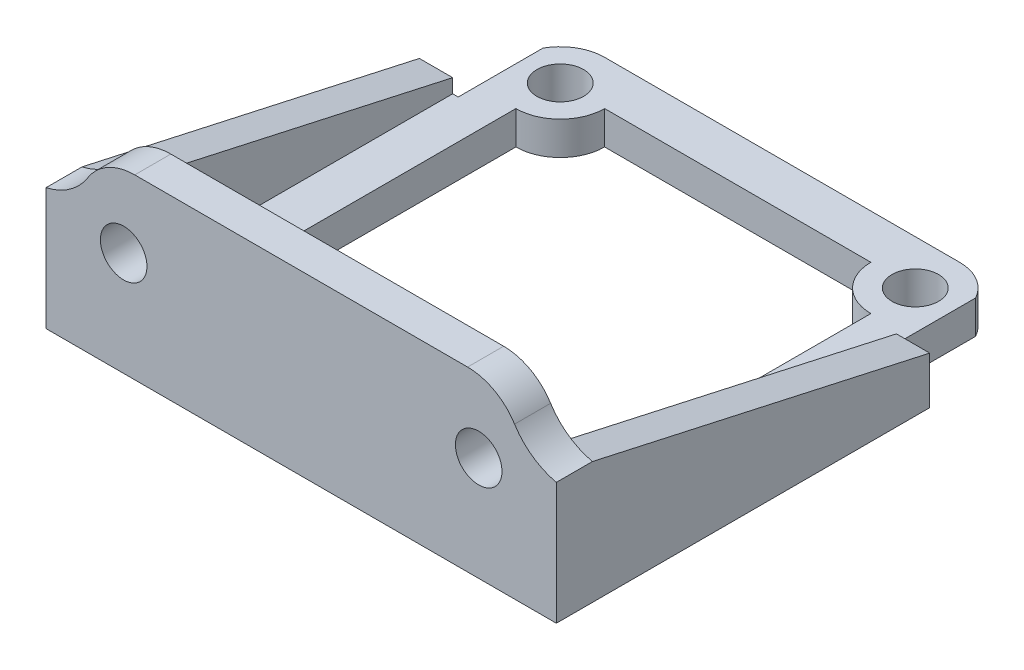
ISO-10303-21;
HEADER;
FILE_DESCRIPTION(('STEP AP214'),'2;1');
FILE_NAME('part.step','',(''),(''),'','','');
FILE_SCHEMA(('AUTOMOTIVE_DESIGN { 1 0 10303 214 1 1 1 1 }'));
ENDSEC;
DATA;
#1=APPLICATION_CONTEXT('core data for automotive mechanical design processes');
#2=APPLICATION_PROTOCOL_DEFINITION('international standard','automotive_design',2000,#1);
#3=PRODUCT_CONTEXT('',#1,'mechanical');
#4=PRODUCT('Part','Part','',(#3));
#5=PRODUCT_RELATED_PRODUCT_CATEGORY('part','',(#4));
#6=PRODUCT_DEFINITION_FORMATION('','',#4);
#7=PRODUCT_DEFINITION_CONTEXT('part definition',#1,'design');
#8=PRODUCT_DEFINITION('design','',#6,#7);
#9=PRODUCT_DEFINITION_SHAPE('','',#8);
#10=(LENGTH_UNIT() NAMED_UNIT(*) SI_UNIT(.MILLI.,.METRE.));
#11=(NAMED_UNIT(*) PLANE_ANGLE_UNIT() SI_UNIT($,.RADIAN.));
#12=(NAMED_UNIT(*) SI_UNIT($,.STERADIAN.) SOLID_ANGLE_UNIT());
#13=UNCERTAINTY_MEASURE_WITH_UNIT(LENGTH_MEASURE(1.E-05),#10,'distance_accuracy_value','');
#14=(GEOMETRIC_REPRESENTATION_CONTEXT(3) GLOBAL_UNCERTAINTY_ASSIGNED_CONTEXT((#13)) GLOBAL_UNIT_ASSIGNED_CONTEXT((#10,
#11,#12)) REPRESENTATION_CONTEXT('',''));
#15=CARTESIAN_POINT('',(0.,0.,0.));
#16=DIRECTION('',(0.,0.,1.));
#17=DIRECTION('',(1.,0.,0.));
#18=AXIS2_PLACEMENT_3D('',#15,#16,#17);
#19=CARTESIAN_POINT('',(32.,3.,-16.));
#20=DIRECTION('',(0.,1.,0.));
#21=DIRECTION('',(0.,0.,1.));
#22=AXIS2_PLACEMENT_3D('',#19,#20,#21);
#23=PLANE('',#22);
#24=DIRECTION('',(0.,0.,-1.));
#25=VECTOR('',#24,1.);
#26=CARTESIAN_POINT('',(-3.49999999999999,3.,-10.3021288200892));
#27=LINE('',#26,#25);
#28=CARTESIAN_POINT('',(-3.49999999999999,3.,-10.3021288200892));
#29=VERTEX_POINT('',#28);
#30=CARTESIAN_POINT('',(-3.49999999999999,3.,-17.9364916731037));
#31=VERTEX_POINT('',#30);
#32=EDGE_CURVE('E311',#29,#31,#27,.T.);
#33=ORIENTED_EDGE('',*,*,#32,.F.);
#34=DIRECTION('',(1.,0.,0.));
#35=VECTOR('',#34,1.);
#36=CARTESIAN_POINT('',(-6.99999999999999,3.,-10.3021288200892));
#37=LINE('',#36,#35);
#38=CARTESIAN_POINT('',(-4.,3.,-10.3021288200892));
#39=VERTEX_POINT('',#38);
#40=EDGE_CURVE('E538',#39,#29,#37,.T.);
#41=ORIENTED_EDGE('',*,*,#40,.F.);
#42=DIRECTION('',(0.,0.,-1.));
#43=VECTOR('',#42,1.);
#44=CARTESIAN_POINT('',(-4.,3.,-16.));
#45=LINE('',#44,#43);
#46=CARTESIAN_POINT('',(-4.,3.,20.1015847961172));
#47=VERTEX_POINT('',#46);
#48=EDGE_CURVE('E349',#47,#39,#45,.T.);
#49=ORIENTED_EDGE('',*,*,#48,.F.);
#50=DIRECTION('',(-1.,0.,0.));
#51=VECTOR('',#50,1.);
#52=CARTESIAN_POINT('',(-4.,3.,20.1015847961172));
#53=LINE('',#52,#51);
#54=CARTESIAN_POINT('',(36.,3.,20.1015847961172));
#55=VERTEX_POINT('',#54);
#56=EDGE_CURVE('E236',#55,#47,#53,.T.);
#57=ORIENTED_EDGE('',*,*,#56,.F.);
#58=DIRECTION('',(0.,0.,-1.));
#59=VECTOR('',#58,1.);
#60=CARTESIAN_POINT('',(36.,3.,23.3515847961172));
#61=LINE('',#60,#59);
#62=CARTESIAN_POINT('',(36.,3.,-10.3021288200892));
#63=VERTEX_POINT('',#62);
#64=EDGE_CURVE('E215',#55,#63,#61,.T.);
#65=ORIENTED_EDGE('',*,*,#64,.T.);
#66=DIRECTION('',(1.,0.,0.));
#67=VECTOR('',#66,1.);
#68=CARTESIAN_POINT('',(39.,3.,-10.3021288200892));
#69=LINE('',#68,#67);
#70=CARTESIAN_POINT('',(35.5,3.,-10.3021288200892));
#71=VERTEX_POINT('',#70);
#72=EDGE_CURVE('E223',#71,#63,#69,.T.);
#73=ORIENTED_EDGE('',*,*,#72,.F.);
#74=DIRECTION('',(0.,0.,1.));
#75=VECTOR('',#74,1.);
#76=CARTESIAN_POINT('',(35.5,3.,-10.3021288200892));
#77=LINE('',#76,#75);
#78=CARTESIAN_POINT('',(35.5,3.,-17.9364916731037));
#79=VERTEX_POINT('',#78);
#80=EDGE_CURVE('E230',#79,#71,#77,.T.);
#81=ORIENTED_EDGE('',*,*,#80,.F.);
#82=CARTESIAN_POINT('',(32.,3.,-16.));
#83=DIRECTION('',(0.,1.,0.));
#84=DIRECTION('',(0.,0.,1.));
#85=AXIS2_PLACEMENT_3D('',#82,#83,#84);
#86=CIRCLE('',#85,4.);
#87=CARTESIAN_POINT('',(32.,3.,-20.));
#88=VERTEX_POINT('',#87);
#89=EDGE_CURVE('E237',#79,#88,#86,.T.);
#90=ORIENTED_EDGE('',*,*,#89,.T.);
#91=DIRECTION('',(-1.,0.,0.));
#92=VECTOR('',#91,1.);
#93=CARTESIAN_POINT('',(0.,3.,-20.));
#94=LINE('',#93,#92);
#95=CARTESIAN_POINT('',(0.,3.,-20.));
#96=VERTEX_POINT('',#95);
#97=EDGE_CURVE('E240',#88,#96,#94,.T.);
#98=ORIENTED_EDGE('',*,*,#97,.T.);
#99=CARTESIAN_POINT('',(0.,3.,-16.));
#100=DIRECTION('',(0.,1.,0.));
#101=DIRECTION('',(0.,0.,1.));
#102=AXIS2_PLACEMENT_3D('',#99,#100,#101);
#103=CIRCLE('',#102,4.);
#104=EDGE_CURVE('E250',#96,#31,#103,.T.);
#105=ORIENTED_EDGE('',*,*,#104,.T.);
#106=EDGE_LOOP('',(#33,#41,#49,#57,#65,#73,#81,#90,#98,#105));
#107=FACE_BOUND('',#106,.T.);
#108=CARTESIAN_POINT('',(32.,3.,-16.));
#109=DIRECTION('',(0.,1.,0.));
#110=DIRECTION('',(0.,0.,1.));
#111=AXIS2_PLACEMENT_3D('',#108,#109,#110);
#112=CIRCLE('',#111,2.1);
#113=CARTESIAN_POINT('',(32.,3.,-13.9));
#114=VERTEX_POINT('',#113);
#115=EDGE_CURVE('E454',#114,#114,#112,.T.);
#116=ORIENTED_EDGE('',*,*,#115,.F.);
#117=EDGE_LOOP('',(#116));
#118=FACE_BOUND('',#117,.T.);
#119=CARTESIAN_POINT('',(0.,3.,-16.));
#120=DIRECTION('',(0.,1.,0.));
#121=DIRECTION('',(0.,0.,1.));
#122=AXIS2_PLACEMENT_3D('',#119,#120,#121);
#123=CIRCLE('',#122,2.1);
#124=CARTESIAN_POINT('',(0.,3.,-13.9));
#125=VERTEX_POINT('',#124);
#126=EDGE_CURVE('E257',#125,#125,#123,.T.);
#127=ORIENTED_EDGE('',*,*,#126,.F.);
#128=EDGE_LOOP('',(#127));
#129=FACE_BOUND('',#128,.T.);
#130=CARTESIAN_POINT('',(0.,3.,16.));
#131=DIRECTION('',(0.,1.,0.));
#132=DIRECTION('',(0.,0.,1.));
#133=AXIS2_PLACEMENT_3D('',#130,#131,#132);
#134=CIRCLE('',#133,2.1);
#135=CARTESIAN_POINT('',(0.,3.,18.1));
#136=VERTEX_POINT('',#135);
#137=EDGE_CURVE('E460',#136,#136,#134,.T.);
#138=ORIENTED_EDGE('',*,*,#137,.F.);
#139=EDGE_LOOP('',(#138));
#140=FACE_BOUND('',#139,.T.);
#141=CARTESIAN_POINT('',(32.,3.,16.));
#142=DIRECTION('',(0.,1.,0.));
#143=DIRECTION('',(0.,0.,1.));
#144=AXIS2_PLACEMENT_3D('',#141,#142,#143);
#145=CIRCLE('',#144,2.1);
#146=CARTESIAN_POINT('',(32.,3.,18.1));
#147=VERTEX_POINT('',#146);
#148=EDGE_CURVE('E448',#147,#147,#145,.T.);
#149=ORIENTED_EDGE('',*,*,#148,.F.);
#150=EDGE_LOOP('',(#149));
#151=FACE_BOUND('',#150,.T.);
#152=DIRECTION('',(0.,0.,1.));
#153=VECTOR('',#152,1.);
#154=CARTESIAN_POINT('',(0.,3.,-12.));
#155=LINE('',#154,#153);
#156=CARTESIAN_POINT('',(0.,3.,-12.));
#157=VERTEX_POINT('',#156);
#158=CARTESIAN_POINT('',(0.,3.,12.));
#159=VERTEX_POINT('',#158);
#160=EDGE_CURVE('E391',#157,#159,#155,.T.);
#161=ORIENTED_EDGE('',*,*,#160,.F.);
#162=CARTESIAN_POINT('',(0.,3.,-16.));
#163=DIRECTION('',(0.,-1.,0.));
#164=DIRECTION('',(0.,0.,1.));
#165=AXIS2_PLACEMENT_3D('',#162,#163,#164);
#166=CIRCLE('',#165,4.);
#167=CARTESIAN_POINT('',(3.99999999999999,3.,-16.));
#168=VERTEX_POINT('',#167);
#169=EDGE_CURVE('E389',#168,#157,#166,.T.);
#170=ORIENTED_EDGE('',*,*,#169,.F.);
#171=DIRECTION('',(-1.,0.,0.));
#172=VECTOR('',#171,1.);
#173=CARTESIAN_POINT('',(3.99999999999999,3.,-16.));
#174=LINE('',#173,#172);
#175=CARTESIAN_POINT('',(28.,3.,-16.));
#176=VERTEX_POINT('',#175);
#177=EDGE_CURVE('E405',#176,#168,#174,.T.);
#178=ORIENTED_EDGE('',*,*,#177,.F.);
#179=CARTESIAN_POINT('',(32.,3.,-16.));
#180=DIRECTION('',(0.,-1.,0.));
#181=DIRECTION('',(0.,0.,1.));
#182=AXIS2_PLACEMENT_3D('',#179,#180,#181);
#183=CIRCLE('',#182,4.);
#184=CARTESIAN_POINT('',(32.,3.,-12.));
#185=VERTEX_POINT('',#184);
#186=EDGE_CURVE('E402',#185,#176,#183,.T.);
#187=ORIENTED_EDGE('',*,*,#186,.F.);
#188=DIRECTION('',(0.,0.,-1.));
#189=VECTOR('',#188,1.);
#190=CARTESIAN_POINT('',(32.,3.,-12.));
#191=LINE('',#190,#189);
#192=CARTESIAN_POINT('',(32.,3.,12.));
#193=VERTEX_POINT('',#192);
#194=EDGE_CURVE('E400',#193,#185,#191,.T.);
#195=ORIENTED_EDGE('',*,*,#194,.F.);
#196=CARTESIAN_POINT('',(32.,3.,16.));
#197=DIRECTION('',(0.,-1.,0.));
#198=DIRECTION('',(0.,0.,1.));
#199=AXIS2_PLACEMENT_3D('',#196,#197,#198);
#200=CIRCLE('',#199,4.);
#201=CARTESIAN_POINT('',(28.,3.,16.));
#202=VERTEX_POINT('',#201);
#203=EDGE_CURVE('E398',#202,#193,#200,.T.);
#204=ORIENTED_EDGE('',*,*,#203,.F.);
#205=DIRECTION('',(1.,0.,0.));
#206=VECTOR('',#205,1.);
#207=CARTESIAN_POINT('',(4.,3.,16.));
#208=LINE('',#207,#206);
#209=CARTESIAN_POINT('',(4.,3.,16.));
#210=VERTEX_POINT('',#209);
#211=EDGE_CURVE('E396',#210,#202,#208,.T.);
#212=ORIENTED_EDGE('',*,*,#211,.F.);
#213=CARTESIAN_POINT('',(0.,3.,16.));
#214=DIRECTION('',(0.,-1.,0.));
#215=DIRECTION('',(0.,0.,1.));
#216=AXIS2_PLACEMENT_3D('',#213,#214,#215);
#217=CIRCLE('',#216,4.);
#218=EDGE_CURVE('E394',#159,#210,#217,.T.);
#219=ORIENTED_EDGE('',*,*,#218,.F.);
#220=EDGE_LOOP('',(#161,#170,#178,#187,#195,#204,#212,#219));
#221=FACE_BOUND('',#220,.T.);
#222=ADVANCED_FACE('F35',(#107,#118,#129,#140,#151,#221),#23,.T.);
#223=CARTESIAN_POINT('',(32.,0.,-16.));
#224=DIRECTION('',(0.,1.,0.));
#225=DIRECTION('',(0.,0.,1.));
#226=AXIS2_PLACEMENT_3D('',#223,#224,#225);
#227=PLANE('',#226);
#228=CARTESIAN_POINT('',(32.,0.,16.));
#229=DIRECTION('',(0.,1.,0.));
#230=DIRECTION('',(0.,0.,1.));
#231=AXIS2_PLACEMENT_3D('',#228,#229,#230);
#232=CIRCLE('',#231,2.1);
#233=CARTESIAN_POINT('',(32.,0.,18.1));
#234=VERTEX_POINT('',#233);
#235=EDGE_CURVE('E447',#234,#234,#232,.T.);
#236=ORIENTED_EDGE('',*,*,#235,.T.);
#237=EDGE_LOOP('',(#236));
#238=FACE_BOUND('',#237,.T.);
#239=CARTESIAN_POINT('',(32.,0.,-16.));
#240=DIRECTION('',(0.,1.,0.));
#241=DIRECTION('',(0.,0.,1.));
#242=AXIS2_PLACEMENT_3D('',#239,#240,#241);
#243=CIRCLE('',#242,2.1);
#244=CARTESIAN_POINT('',(32.,0.,-13.9));
#245=VERTEX_POINT('',#244);
#246=EDGE_CURVE('E451',#245,#245,#243,.T.);
#247=ORIENTED_EDGE('',*,*,#246,.T.);
#248=EDGE_LOOP('',(#247));
#249=FACE_BOUND('',#248,.T.);
#250=CARTESIAN_POINT('',(0.,0.,16.));
#251=DIRECTION('',(0.,1.,0.));
#252=DIRECTION('',(0.,0.,1.));
#253=AXIS2_PLACEMENT_3D('',#250,#251,#252);
#254=CIRCLE('',#253,2.1);
#255=CARTESIAN_POINT('',(0.,0.,18.1));
#256=VERTEX_POINT('',#255);
#257=EDGE_CURVE('E457',#256,#256,#254,.T.);
#258=ORIENTED_EDGE('',*,*,#257,.T.);
#259=EDGE_LOOP('',(#258));
#260=FACE_BOUND('',#259,.T.);
#261=CARTESIAN_POINT('',(0.,0.,-16.));
#262=DIRECTION('',(0.,1.,0.));
#263=DIRECTION('',(0.,0.,1.));
#264=AXIS2_PLACEMENT_3D('',#261,#262,#263);
#265=CIRCLE('',#264,2.1);
#266=CARTESIAN_POINT('',(0.,0.,-13.9));
#267=VERTEX_POINT('',#266);
#268=EDGE_CURVE('E246',#267,#267,#265,.T.);
#269=ORIENTED_EDGE('',*,*,#268,.T.);
#270=EDGE_LOOP('',(#269));
#271=FACE_BOUND('',#270,.T.);
#272=DIRECTION('',(1.,0.,0.));
#273=VECTOR('',#272,1.);
#274=CARTESIAN_POINT('',(32.,0.,-10.3021288200892));
#275=LINE('',#274,#273);
#276=CARTESIAN_POINT('',(-6.99999999999999,0.,-10.3021288200892));
#277=VERTEX_POINT('',#276);
#278=CARTESIAN_POINT('',(-3.49999999999999,0.,-10.3021288200892));
#279=VERTEX_POINT('',#278);
#280=EDGE_CURVE('E326',#277,#279,#275,.T.);
#281=ORIENTED_EDGE('',*,*,#280,.T.);
#282=DIRECTION('',(0.,0.,-1.));
#283=VECTOR('',#282,1.);
#284=CARTESIAN_POINT('',(-3.5,0.,-16.));
#285=LINE('',#284,#283);
#286=CARTESIAN_POINT('',(-3.49999999999999,0.,-17.9364916731037));
#287=VERTEX_POINT('',#286);
#288=EDGE_CURVE('E324',#279,#287,#285,.T.);
#289=ORIENTED_EDGE('',*,*,#288,.T.);
#290=CARTESIAN_POINT('',(0.,0.,-16.));
#291=DIRECTION('',(0.,1.,0.));
#292=DIRECTION('',(0.,0.,1.));
#293=AXIS2_PLACEMENT_3D('',#290,#291,#292);
#294=CIRCLE('',#293,4.);
#295=CARTESIAN_POINT('',(0.,0.,-20.));
#296=VERTEX_POINT('',#295);
#297=EDGE_CURVE('E238',#296,#287,#294,.T.);
#298=ORIENTED_EDGE('',*,*,#297,.F.);
#299=DIRECTION('',(-1.,0.,0.));
#300=VECTOR('',#299,1.);
#301=CARTESIAN_POINT('',(0.,0.,-20.));
#302=LINE('',#301,#300);
#303=CARTESIAN_POINT('',(32.,0.,-20.));
#304=VERTEX_POINT('',#303);
#305=EDGE_CURVE('E243',#304,#296,#302,.T.);
#306=ORIENTED_EDGE('',*,*,#305,.F.);
#307=CARTESIAN_POINT('',(32.,0.,-16.));
#308=DIRECTION('',(0.,1.,0.));
#309=DIRECTION('',(0.,0.,1.));
#310=AXIS2_PLACEMENT_3D('',#307,#308,#309);
#311=CIRCLE('',#310,4.);
#312=CARTESIAN_POINT('',(35.5,0.,-17.9364916731037));
#313=VERTEX_POINT('',#312);
#314=EDGE_CURVE('E256',#313,#304,#311,.T.);
#315=ORIENTED_EDGE('',*,*,#314,.F.);
#316=DIRECTION('',(0.,0.,1.));
#317=VECTOR('',#316,1.);
#318=CARTESIAN_POINT('',(35.5,0.,-16.));
#319=LINE('',#318,#317);
#320=CARTESIAN_POINT('',(35.5,0.,-10.3021288200892));
#321=VERTEX_POINT('',#320);
#322=EDGE_CURVE('E328',#313,#321,#319,.T.);
#323=ORIENTED_EDGE('',*,*,#322,.T.);
#324=DIRECTION('',(1.,0.,0.));
#325=VECTOR('',#324,1.);
#326=CARTESIAN_POINT('',(32.,0.,-10.3021288200892));
#327=LINE('',#326,#325);
#328=CARTESIAN_POINT('',(39.,0.,-10.3021288200892));
#329=VERTEX_POINT('',#328);
#330=EDGE_CURVE('E329',#321,#329,#327,.T.);
#331=ORIENTED_EDGE('',*,*,#330,.T.);
#332=DIRECTION('',(0.,0.,-1.));
#333=VECTOR('',#332,1.);
#334=CARTESIAN_POINT('',(39.,0.,-12.));
#335=LINE('',#334,#333);
#336=CARTESIAN_POINT('',(39.,0.,23.3515847961172));
#337=VERTEX_POINT('',#336);
#338=EDGE_CURVE('E359',#337,#329,#335,.T.);
#339=ORIENTED_EDGE('',*,*,#338,.F.);
#340=DIRECTION('',(1.,0.,0.));
#341=VECTOR('',#340,1.);
#342=CARTESIAN_POINT('',(-4.,0.,23.3515847961172));
#343=LINE('',#342,#341);
#344=CARTESIAN_POINT('',(-7.,0.,23.3515847961172));
#345=VERTEX_POINT('',#344);
#346=EDGE_CURVE('E254',#345,#337,#343,.T.);
#347=ORIENTED_EDGE('',*,*,#346,.F.);
#348=DIRECTION('',(0.,0.,1.));
#349=VECTOR('',#348,1.);
#350=CARTESIAN_POINT('',(-7.,0.,23.3515847961172));
#351=LINE('',#350,#349);
#352=EDGE_CURVE('E338',#277,#345,#351,.T.);
#353=ORIENTED_EDGE('',*,*,#352,.F.);
#354=EDGE_LOOP('',(#281,#289,#298,#306,#315,#323,#331,#339,#347,#353));
#355=FACE_BOUND('',#354,.T.);
#356=CARTESIAN_POINT('',(0.,0.,-16.));
#357=DIRECTION('',(0.,-1.,0.));
#358=DIRECTION('',(0.,0.,1.));
#359=AXIS2_PLACEMENT_3D('',#356,#357,#358);
#360=CIRCLE('',#359,4.);
#361=CARTESIAN_POINT('',(4.,0.,-16.));
#362=VERTEX_POINT('',#361);
#363=CARTESIAN_POINT('',(0.,0.,-12.));
#364=VERTEX_POINT('',#363);
#365=EDGE_CURVE('E388',#362,#364,#360,.T.);
#366=ORIENTED_EDGE('',*,*,#365,.T.);
#367=DIRECTION('',(0.,0.,1.));
#368=VECTOR('',#367,1.);
#369=CARTESIAN_POINT('',(0.,0.,-12.));
#370=LINE('',#369,#368);
#371=CARTESIAN_POINT('',(0.,0.,12.));
#372=VERTEX_POINT('',#371);
#373=EDGE_CURVE('E410',#364,#372,#370,.T.);
#374=ORIENTED_EDGE('',*,*,#373,.T.);
#375=CARTESIAN_POINT('',(0.,0.,16.));
#376=DIRECTION('',(0.,-1.,0.));
#377=DIRECTION('',(0.,0.,1.));
#378=AXIS2_PLACEMENT_3D('',#375,#376,#377);
#379=CIRCLE('',#378,4.);
#380=CARTESIAN_POINT('',(4.,0.,16.));
#381=VERTEX_POINT('',#380);
#382=EDGE_CURVE('E413',#372,#381,#379,.T.);
#383=ORIENTED_EDGE('',*,*,#382,.T.);
#384=DIRECTION('',(1.,0.,0.));
#385=VECTOR('',#384,1.);
#386=CARTESIAN_POINT('',(4.,0.,16.));
#387=LINE('',#386,#385);
#388=CARTESIAN_POINT('',(28.,0.,16.));
#389=VERTEX_POINT('',#388);
#390=EDGE_CURVE('E416',#381,#389,#387,.T.);
#391=ORIENTED_EDGE('',*,*,#390,.T.);
#392=CARTESIAN_POINT('',(32.,0.,16.));
#393=DIRECTION('',(0.,-1.,0.));
#394=DIRECTION('',(0.,0.,1.));
#395=AXIS2_PLACEMENT_3D('',#392,#393,#394);
#396=CIRCLE('',#395,4.);
#397=CARTESIAN_POINT('',(32.,0.,12.));
#398=VERTEX_POINT('',#397);
#399=EDGE_CURVE('E419',#389,#398,#396,.T.);
#400=ORIENTED_EDGE('',*,*,#399,.T.);
#401=DIRECTION('',(0.,0.,-1.));
#402=VECTOR('',#401,1.);
#403=CARTESIAN_POINT('',(32.,0.,-12.));
#404=LINE('',#403,#402);
#405=CARTESIAN_POINT('',(32.,0.,-12.));
#406=VERTEX_POINT('',#405);
#407=EDGE_CURVE('E422',#398,#406,#404,.T.);
#408=ORIENTED_EDGE('',*,*,#407,.T.);
#409=CARTESIAN_POINT('',(32.,0.,-16.));
#410=DIRECTION('',(0.,-1.,0.));
#411=DIRECTION('',(0.,0.,1.));
#412=AXIS2_PLACEMENT_3D('',#409,#410,#411);
#413=CIRCLE('',#412,4.);
#414=CARTESIAN_POINT('',(28.,0.,-16.));
#415=VERTEX_POINT('',#414);
#416=EDGE_CURVE('E425',#406,#415,#413,.T.);
#417=ORIENTED_EDGE('',*,*,#416,.T.);
#418=DIRECTION('',(-1.,0.,0.));
#419=VECTOR('',#418,1.);
#420=CARTESIAN_POINT('',(3.99999999999999,0.,-16.));
#421=LINE('',#420,#419);
#422=EDGE_CURVE('E392',#415,#362,#421,.T.);
#423=ORIENTED_EDGE('',*,*,#422,.T.);
#424=EDGE_LOOP('',(#366,#374,#383,#391,#400,#408,#417,#423));
#425=FACE_BOUND('',#424,.T.);
#426=ADVANCED_FACE('F321',(#238,#249,#260,#271,#355,#425),#227,.F.);
#427=CARTESIAN_POINT('',(-4.,3.,23.3515847961172));
#428=DIRECTION('',(0.,0.,-1.));
#429=DIRECTION('',(-1.,0.,0.));
#430=AXIS2_PLACEMENT_3D('',#427,#428,#429);
#431=PLANE('',#430);
#432=CARTESIAN_POINT('',(0.00061680222324112,9.39621606842088,23.3515847961172));
#433=DIRECTION('',(0.,0.,-1.));
#434=DIRECTION('',(-1.,0.,0.));
#435=AXIS2_PLACEMENT_3D('',#432,#433,#434);
#436=CIRCLE('',#435,2.1);
#437=CARTESIAN_POINT('',(-2.09938319777676,9.39621606842088,23.3515847961172));
#438=VERTEX_POINT('',#437);
#439=EDGE_CURVE('E373',#438,#438,#436,.T.);
#440=ORIENTED_EDGE('',*,*,#439,.T.);
#441=EDGE_LOOP('',(#440));
#442=FACE_BOUND('',#441,.T.);
#443=CARTESIAN_POINT('',(31.9993831977767,9.39621606842088,23.3515847961172));
#444=DIRECTION('',(0.,0.,-1.));
#445=DIRECTION('',(-1.,0.,0.));
#446=AXIS2_PLACEMENT_3D('',#443,#444,#445);
#447=CIRCLE('',#446,2.1);
#448=CARTESIAN_POINT('',(29.8993831977767,9.39621606842088,23.3515847961172));
#449=VERTEX_POINT('',#448);
#450=EDGE_CURVE('E368',#449,#449,#447,.T.);
#451=ORIENTED_EDGE('',*,*,#450,.T.);
#452=EDGE_LOOP('',(#451));
#453=FACE_BOUND('',#452,.T.);
#454=ORIENTED_EDGE('',*,*,#346,.T.);
#455=DIRECTION('',(0.,-1.,0.));
#456=VECTOR('',#455,1.);
#457=CARTESIAN_POINT('',(39.,0.,23.3515847961172));
#458=LINE('',#457,#456);
#459=CARTESIAN_POINT('',(39.,11.,23.3515847961172));
#460=VERTEX_POINT('',#459);
#461=EDGE_CURVE('E356',#460,#337,#458,.T.);
#462=ORIENTED_EDGE('',*,*,#461,.F.);
#463=CARTESIAN_POINT('',(40.3125,16.8546856234985,23.3515847961172));
#464=DIRECTION('',(0.,0.,-1.));
#465=DIRECTION('',(-1.,0.,0.));
#466=AXIS2_PLACEMENT_3D('',#463,#464,#465);
#467=CIRCLE('',#466,6.);
#468=CARTESIAN_POINT('',(35.2329545454545,13.6612207379539,23.3515847961172));
#469=VERTEX_POINT('',#468);
#470=EDGE_CURVE('E285',#460,#469,#467,.T.);
#471=ORIENTED_EDGE('',*,*,#470,.T.);
#472=CARTESIAN_POINT('',(31.,11.,23.3515847961172));
#473=DIRECTION('',(0.,0.,-1.));
#474=DIRECTION('',(-1.,0.,0.));
#475=AXIS2_PLACEMENT_3D('',#472,#473,#474);
#476=CIRCLE('',#475,5.);
#477=CARTESIAN_POINT('',(31.,16.,23.3515847961172));
#478=VERTEX_POINT('',#477);
#479=EDGE_CURVE('E279',#469,#478,#476,.F.);
#480=ORIENTED_EDGE('',*,*,#479,.T.);
#481=DIRECTION('',(1.,0.,0.));
#482=VECTOR('',#481,1.);
#483=CARTESIAN_POINT('',(-4.,16.,23.3515847961172));
#484=LINE('',#483,#482);
#485=CARTESIAN_POINT('',(1.,16.,23.3515847961172));
#486=VERTEX_POINT('',#485);
#487=EDGE_CURVE('E376',#486,#478,#484,.T.);
#488=ORIENTED_EDGE('',*,*,#487,.F.);
#489=CARTESIAN_POINT('',(1.,11.,23.3515847961172));
#490=DIRECTION('',(0.,0.,-1.));
#491=DIRECTION('',(-1.,0.,0.));
#492=AXIS2_PLACEMENT_3D('',#489,#490,#491);
#493=CIRCLE('',#492,5.);
#494=CARTESIAN_POINT('',(-3.23295454545454,13.6612207379539,23.3515847961172));
#495=VERTEX_POINT('',#494);
#496=EDGE_CURVE('E276',#486,#495,#493,.F.);
#497=ORIENTED_EDGE('',*,*,#496,.T.);
#498=CARTESIAN_POINT('',(-8.31249999999999,16.8546856234985,23.3515847961172));
#499=DIRECTION('',(0.,0.,-1.));
#500=DIRECTION('',(-1.,0.,0.));
#501=AXIS2_PLACEMENT_3D('',#498,#499,#500);
#502=CIRCLE('',#501,6.);
#503=CARTESIAN_POINT('',(-7.,11.,23.3515847961172));
#504=VERTEX_POINT('',#503);
#505=EDGE_CURVE('E291',#495,#504,#502,.T.);
#506=ORIENTED_EDGE('',*,*,#505,.T.);
#507=DIRECTION('',(0.,1.,0.));
#508=VECTOR('',#507,1.);
#509=CARTESIAN_POINT('',(-7.,11.,23.3515847961172));
#510=LINE('',#509,#508);
#511=EDGE_CURVE('E340',#345,#504,#510,.T.);
#512=ORIENTED_EDGE('',*,*,#511,.F.);
#513=EDGE_LOOP('',(#454,#462,#471,#480,#488,#497,#506,#512));
#514=FACE_BOUND('',#513,.T.);
#515=ADVANCED_FACE('F488',(#442,#453,#514),#431,.F.);
#516=CARTESIAN_POINT('',(32.,3.,-16.));
#517=DIRECTION('',(0.,-1.,0.));
#518=DIRECTION('',(0.,0.,-1.));
#519=AXIS2_PLACEMENT_3D('',#516,#517,#518);
#520=CYLINDRICAL_SURFACE('',#519,4.);
#521=ORIENTED_EDGE('',*,*,#89,.F.);
#522=DIRECTION('',(0.,-1.,0.));
#523=VECTOR('',#522,1.);
#524=CARTESIAN_POINT('',(35.5,3.,-17.9364916731037));
#525=LINE('',#524,#523);
#526=EDGE_CURVE('E11',#79,#313,#525,.T.);
#527=ORIENTED_EDGE('',*,*,#526,.T.);
#528=ORIENTED_EDGE('',*,*,#314,.T.);
#529=DIRECTION('',(0.,-1.,0.));
#530=VECTOR('',#529,1.);
#531=CARTESIAN_POINT('',(32.,3.,-20.));
#532=LINE('',#531,#530);
#533=EDGE_CURVE('E262',#88,#304,#532,.T.);
#534=ORIENTED_EDGE('',*,*,#533,.F.);
#535=EDGE_LOOP('',(#521,#527,#528,#534));
#536=FACE_BOUND('',#535,.T.);
#537=ADVANCED_FACE('F494',(#536),#520,.T.);
#538=CARTESIAN_POINT('',(0.,3.,-20.));
#539=DIRECTION('',(0.,0.,1.));
#540=DIRECTION('',(1.,0.,0.));
#541=AXIS2_PLACEMENT_3D('',#538,#539,#540);
#542=PLANE('',#541);
#543=ORIENTED_EDGE('',*,*,#305,.T.);
#544=DIRECTION('',(0.,-1.,0.));
#545=VECTOR('',#544,1.);
#546=CARTESIAN_POINT('',(0.,3.,-20.));
#547=LINE('',#546,#545);
#548=EDGE_CURVE('E253',#96,#296,#547,.T.);
#549=ORIENTED_EDGE('',*,*,#548,.F.);
#550=ORIENTED_EDGE('',*,*,#97,.F.);
#551=ORIENTED_EDGE('',*,*,#533,.T.);
#552=EDGE_LOOP('',(#543,#549,#550,#551));
#553=FACE_BOUND('',#552,.T.);
#554=ADVANCED_FACE('F317',(#553),#542,.F.);
#555=CARTESIAN_POINT('',(0.,3.,-16.));
#556=DIRECTION('',(0.,-1.,0.));
#557=DIRECTION('',(0.,0.,-1.));
#558=AXIS2_PLACEMENT_3D('',#555,#556,#557);
#559=CYLINDRICAL_SURFACE('',#558,4.);
#560=ORIENTED_EDGE('',*,*,#297,.T.);
#561=DIRECTION('',(0.,-1.,0.));
#562=VECTOR('',#561,1.);
#563=CARTESIAN_POINT('',(-3.49999999999999,3.,-17.9364916731037));
#564=LINE('',#563,#562);
#565=EDGE_CURVE('E44',#287,#31,#564,.F.);
#566=ORIENTED_EDGE('',*,*,#565,.T.);
#567=ORIENTED_EDGE('',*,*,#104,.F.);
#568=ORIENTED_EDGE('',*,*,#548,.T.);
#569=EDGE_LOOP('',(#560,#566,#567,#568));
#570=FACE_BOUND('',#569,.T.);
#571=ADVANCED_FACE('F306',(#570),#559,.T.);
#572=CARTESIAN_POINT('',(0.,3.,-16.));
#573=DIRECTION('',(0.,-1.,0.));
#574=DIRECTION('',(0.,0.,-1.));
#575=AXIS2_PLACEMENT_3D('',#572,#573,#574);
#576=CYLINDRICAL_SURFACE('',#575,2.1);
#577=ORIENTED_EDGE('',*,*,#126,.T.);
#578=EDGE_LOOP('',(#577));
#579=FACE_BOUND('',#578,.T.);
#580=ORIENTED_EDGE('',*,*,#268,.F.);
#581=EDGE_LOOP('',(#580));
#582=FACE_BOUND('',#581,.T.);
#583=ADVANCED_FACE('F471',(#579,#582),#576,.F.);
#584=CARTESIAN_POINT('',(0.,3.,16.));
#585=DIRECTION('',(0.,-1.,0.));
#586=DIRECTION('',(0.,0.,-1.));
#587=AXIS2_PLACEMENT_3D('',#584,#585,#586);
#588=CYLINDRICAL_SURFACE('',#587,2.1);
#589=ORIENTED_EDGE('',*,*,#137,.T.);
#590=EDGE_LOOP('',(#589));
#591=FACE_BOUND('',#590,.T.);
#592=ORIENTED_EDGE('',*,*,#257,.F.);
#593=EDGE_LOOP('',(#592));
#594=FACE_BOUND('',#593,.T.);
#595=ADVANCED_FACE('F473',(#591,#594),#588,.F.);
#596=CARTESIAN_POINT('',(32.,3.,-16.));
#597=DIRECTION('',(0.,-1.,0.));
#598=DIRECTION('',(0.,0.,-1.));
#599=AXIS2_PLACEMENT_3D('',#596,#597,#598);
#600=CYLINDRICAL_SURFACE('',#599,2.1);
#601=ORIENTED_EDGE('',*,*,#115,.T.);
#602=EDGE_LOOP('',(#601));
#603=FACE_BOUND('',#602,.T.);
#604=ORIENTED_EDGE('',*,*,#246,.F.);
#605=EDGE_LOOP('',(#604));
#606=FACE_BOUND('',#605,.T.);
#607=ADVANCED_FACE('F479',(#603,#606),#600,.F.);
#608=CARTESIAN_POINT('',(32.,3.,16.));
#609=DIRECTION('',(0.,-1.,0.));
#610=DIRECTION('',(0.,0.,-1.));
#611=AXIS2_PLACEMENT_3D('',#608,#609,#610);
#612=CYLINDRICAL_SURFACE('',#611,2.1);
#613=ORIENTED_EDGE('',*,*,#148,.T.);
#614=EDGE_LOOP('',(#613));
#615=FACE_BOUND('',#614,.T.);
#616=ORIENTED_EDGE('',*,*,#235,.F.);
#617=EDGE_LOOP('',(#616));
#618=FACE_BOUND('',#617,.T.);
#619=ADVANCED_FACE('F617',(#615,#618),#612,.F.);
#620=CARTESIAN_POINT('',(0.,3.,-16.));
#621=DIRECTION('',(0.,-1.,0.));
#622=DIRECTION('',(0.,0.,-1.));
#623=AXIS2_PLACEMENT_3D('',#620,#621,#622);
#624=CYLINDRICAL_SURFACE('',#623,4.);
#625=ORIENTED_EDGE('',*,*,#365,.F.);
#626=DIRECTION('',(0.,-1.,0.));
#627=VECTOR('',#626,1.);
#628=CARTESIAN_POINT('',(3.99999999999999,3.,-16.));
#629=LINE('',#628,#627);
#630=EDGE_CURVE('E407',#168,#362,#629,.T.);
#631=ORIENTED_EDGE('',*,*,#630,.F.);
#632=ORIENTED_EDGE('',*,*,#169,.T.);
#633=DIRECTION('',(0.,-1.,0.));
#634=VECTOR('',#633,1.);
#635=CARTESIAN_POINT('',(0.,3.,-12.));
#636=LINE('',#635,#634);
#637=EDGE_CURVE('E444',#157,#364,#636,.T.);
#638=ORIENTED_EDGE('',*,*,#637,.T.);
#639=EDGE_LOOP('',(#625,#631,#632,#638));
#640=FACE_BOUND('',#639,.T.);
#641=ADVANCED_FACE('F613',(#640),#624,.T.);
#642=CARTESIAN_POINT('',(0.,3.,-12.));
#643=DIRECTION('',(1.,0.,0.));
#644=DIRECTION('',(0.,0.,-1.));
#645=AXIS2_PLACEMENT_3D('',#642,#643,#644);
#646=PLANE('',#645);
#647=ORIENTED_EDGE('',*,*,#373,.F.);
#648=ORIENTED_EDGE('',*,*,#637,.F.);
#649=ORIENTED_EDGE('',*,*,#160,.T.);
#650=DIRECTION('',(0.,-1.,0.));
#651=VECTOR('',#650,1.);
#652=CARTESIAN_POINT('',(0.,3.,12.));
#653=LINE('',#652,#651);
#654=EDGE_CURVE('E442',#159,#372,#653,.T.);
#655=ORIENTED_EDGE('',*,*,#654,.T.);
#656=EDGE_LOOP('',(#647,#648,#649,#655));
#657=FACE_BOUND('',#656,.T.);
#658=ADVANCED_FACE('F609',(#657),#646,.T.);
#659=CARTESIAN_POINT('',(0.,3.,16.));
#660=DIRECTION('',(0.,-1.,0.));
#661=DIRECTION('',(0.,0.,-1.));
#662=AXIS2_PLACEMENT_3D('',#659,#660,#661);
#663=CYLINDRICAL_SURFACE('',#662,4.);
#664=ORIENTED_EDGE('',*,*,#382,.F.);
#665=ORIENTED_EDGE('',*,*,#654,.F.);
#666=ORIENTED_EDGE('',*,*,#218,.T.);
#667=DIRECTION('',(0.,-1.,0.));
#668=VECTOR('',#667,1.);
#669=CARTESIAN_POINT('',(4.,3.,16.));
#670=LINE('',#669,#668);
#671=EDGE_CURVE('E440',#210,#381,#670,.T.);
#672=ORIENTED_EDGE('',*,*,#671,.T.);
#673=EDGE_LOOP('',(#664,#665,#666,#672));
#674=FACE_BOUND('',#673,.T.);
#675=ADVANCED_FACE('F605',(#674),#663,.T.);
#676=CARTESIAN_POINT('',(4.,3.,16.));
#677=DIRECTION('',(0.,0.,-1.));
#678=DIRECTION('',(-1.,0.,0.));
#679=AXIS2_PLACEMENT_3D('',#676,#677,#678);
#680=PLANE('',#679);
#681=ORIENTED_EDGE('',*,*,#390,.F.);
#682=ORIENTED_EDGE('',*,*,#671,.F.);
#683=ORIENTED_EDGE('',*,*,#211,.T.);
#684=DIRECTION('',(0.,-1.,0.));
#685=VECTOR('',#684,1.);
#686=CARTESIAN_POINT('',(28.,3.,16.));
#687=LINE('',#686,#685);
#688=EDGE_CURVE('E438',#202,#389,#687,.T.);
#689=ORIENTED_EDGE('',*,*,#688,.T.);
#690=EDGE_LOOP('',(#681,#682,#683,#689));
#691=FACE_BOUND('',#690,.T.);
#692=ADVANCED_FACE('F601',(#691),#680,.T.);
#693=CARTESIAN_POINT('',(32.,3.,16.));
#694=DIRECTION('',(0.,-1.,0.));
#695=DIRECTION('',(0.,0.,-1.));
#696=AXIS2_PLACEMENT_3D('',#693,#694,#695);
#697=CYLINDRICAL_SURFACE('',#696,4.);
#698=ORIENTED_EDGE('',*,*,#399,.F.);
#699=ORIENTED_EDGE('',*,*,#688,.F.);
#700=ORIENTED_EDGE('',*,*,#203,.T.);
#701=DIRECTION('',(0.,-1.,0.));
#702=VECTOR('',#701,1.);
#703=CARTESIAN_POINT('',(32.,3.,12.));
#704=LINE('',#703,#702);
#705=EDGE_CURVE('E436',#193,#398,#704,.T.);
#706=ORIENTED_EDGE('',*,*,#705,.T.);
#707=EDGE_LOOP('',(#698,#699,#700,#706));
#708=FACE_BOUND('',#707,.T.);
#709=ADVANCED_FACE('F597',(#708),#697,.T.);
#710=CARTESIAN_POINT('',(32.,3.,-12.));
#711=DIRECTION('',(-1.,0.,0.));
#712=DIRECTION('',(0.,0.,1.));
#713=AXIS2_PLACEMENT_3D('',#710,#711,#712);
#714=PLANE('',#713);
#715=ORIENTED_EDGE('',*,*,#407,.F.);
#716=ORIENTED_EDGE('',*,*,#705,.F.);
#717=ORIENTED_EDGE('',*,*,#194,.T.);
#718=DIRECTION('',(0.,-1.,0.));
#719=VECTOR('',#718,1.);
#720=CARTESIAN_POINT('',(32.,3.,-12.));
#721=LINE('',#720,#719);
#722=EDGE_CURVE('E434',#185,#406,#721,.T.);
#723=ORIENTED_EDGE('',*,*,#722,.T.);
#724=EDGE_LOOP('',(#715,#716,#717,#723));
#725=FACE_BOUND('',#724,.T.);
#726=ADVANCED_FACE('F593',(#725),#714,.T.);
#727=CARTESIAN_POINT('',(32.,3.,-16.));
#728=DIRECTION('',(0.,-1.,0.));
#729=DIRECTION('',(0.,0.,-1.));
#730=AXIS2_PLACEMENT_3D('',#727,#728,#729);
#731=CYLINDRICAL_SURFACE('',#730,4.);
#732=ORIENTED_EDGE('',*,*,#416,.F.);
#733=ORIENTED_EDGE('',*,*,#722,.F.);
#734=ORIENTED_EDGE('',*,*,#186,.T.);
#735=DIRECTION('',(0.,-1.,0.));
#736=VECTOR('',#735,1.);
#737=CARTESIAN_POINT('',(28.,3.,-16.));
#738=LINE('',#737,#736);
#739=EDGE_CURVE('E432',#176,#415,#738,.T.);
#740=ORIENTED_EDGE('',*,*,#739,.T.);
#741=EDGE_LOOP('',(#732,#733,#734,#740));
#742=FACE_BOUND('',#741,.T.);
#743=ADVANCED_FACE('F589',(#742),#731,.T.);
#744=CARTESIAN_POINT('',(3.99999999999999,3.,-16.));
#745=DIRECTION('',(0.,0.,1.));
#746=DIRECTION('',(1.,0.,0.));
#747=AXIS2_PLACEMENT_3D('',#744,#745,#746);
#748=PLANE('',#747);
#749=ORIENTED_EDGE('',*,*,#422,.F.);
#750=ORIENTED_EDGE('',*,*,#739,.F.);
#751=ORIENTED_EDGE('',*,*,#177,.T.);
#752=ORIENTED_EDGE('',*,*,#630,.T.);
#753=EDGE_LOOP('',(#749,#750,#751,#752));
#754=FACE_BOUND('',#753,.T.);
#755=ADVANCED_FACE('F582',(#754),#748,.T.);
#756=CARTESIAN_POINT('',(-4.,16.,20.1015847961172));
#757=DIRECTION('',(0.,0.,1.));
#758=DIRECTION('',(1.,0.,0.));
#759=AXIS2_PLACEMENT_3D('',#756,#757,#758);
#760=PLANE('',#759);
#761=CARTESIAN_POINT('',(0.00061680222324112,9.39621606842088,20.1015847961172));
#762=DIRECTION('',(0.,0.,-1.));
#763=DIRECTION('',(-1.,0.,0.));
#764=AXIS2_PLACEMENT_3D('',#761,#762,#763);
#765=CIRCLE('',#764,2.1);
#766=CARTESIAN_POINT('',(-2.09938319777676,9.39621606842088,20.1015847961172));
#767=VERTEX_POINT('',#766);
#768=EDGE_CURVE('E365',#767,#767,#765,.T.);
#769=ORIENTED_EDGE('',*,*,#768,.F.);
#770=EDGE_LOOP('',(#769));
#771=FACE_BOUND('',#770,.T.);
#772=CARTESIAN_POINT('',(31.9993831977767,9.39621606842088,20.1015847961172));
#773=DIRECTION('',(0.,0.,-1.));
#774=DIRECTION('',(-1.,0.,0.));
#775=AXIS2_PLACEMENT_3D('',#772,#773,#774);
#776=CIRCLE('',#775,2.1);
#777=CARTESIAN_POINT('',(29.8993831977767,9.39621606842088,20.1015847961172));
#778=VERTEX_POINT('',#777);
#779=EDGE_CURVE('E363',#778,#778,#776,.T.);
#780=ORIENTED_EDGE('',*,*,#779,.F.);
#781=EDGE_LOOP('',(#780));
#782=FACE_BOUND('',#781,.T.);
#783=DIRECTION('',(-1.,0.,0.));
#784=VECTOR('',#783,1.);
#785=CARTESIAN_POINT('',(-4.,16.,20.1015847961172));
#786=LINE('',#785,#784);
#787=CARTESIAN_POINT('',(31.,16.,20.1015847961172));
#788=VERTEX_POINT('',#787);
#789=CARTESIAN_POINT('',(1.,16.,20.1015847961172));
#790=VERTEX_POINT('',#789);
#791=EDGE_CURVE('E379',#788,#790,#786,.T.);
#792=ORIENTED_EDGE('',*,*,#791,.F.);
#793=CARTESIAN_POINT('',(31.,11.,20.1015847961172));
#794=DIRECTION('',(0.,0.,1.));
#795=DIRECTION('',(1.,0.,0.));
#796=AXIS2_PLACEMENT_3D('',#793,#794,#795);
#797=CIRCLE('',#796,5.);
#798=CARTESIAN_POINT('',(35.2329545454545,13.6612207379539,20.1015847961172));
#799=VERTEX_POINT('',#798);
#800=EDGE_CURVE('E273',#788,#799,#797,.F.);
#801=ORIENTED_EDGE('',*,*,#800,.T.);
#802=CARTESIAN_POINT('',(40.3125,16.8546856234985,20.1015847961172));
#803=DIRECTION('',(0.,0.,1.));
#804=DIRECTION('',(1.,0.,0.));
#805=AXIS2_PLACEMENT_3D('',#802,#803,#804);
#806=CIRCLE('',#805,6.);
#807=CARTESIAN_POINT('',(39.,11.,20.1015847961172));
#808=VERTEX_POINT('',#807);
#809=EDGE_CURVE('E287',#799,#808,#806,.T.);
#810=ORIENTED_EDGE('',*,*,#809,.T.);
#811=DIRECTION('',(1.,0.,0.));
#812=VECTOR('',#811,1.);
#813=CARTESIAN_POINT('',(-4.,11.,20.1015847961172));
#814=LINE('',#813,#812);
#815=CARTESIAN_POINT('',(36.,11.,20.1015847961172));
#816=VERTEX_POINT('',#815);
#817=EDGE_CURVE('E293',#816,#808,#814,.T.);
#818=ORIENTED_EDGE('',*,*,#817,.F.);
#819=DIRECTION('',(0.,-1.,0.));
#820=VECTOR('',#819,1.);
#821=CARTESIAN_POINT('',(36.,16.,20.1015847961172));
#822=LINE('',#821,#820);
#823=EDGE_CURVE('E386',#816,#55,#822,.T.);
#824=ORIENTED_EDGE('',*,*,#823,.T.);
#825=ORIENTED_EDGE('',*,*,#56,.T.);
#826=DIRECTION('',(0.,-1.,0.));
#827=VECTOR('',#826,1.);
#828=CARTESIAN_POINT('',(-4.,16.,20.1015847961172));
#829=LINE('',#828,#827);
#830=CARTESIAN_POINT('',(-4.,11.,20.1015847961172));
#831=VERTEX_POINT('',#830);
#832=EDGE_CURVE('E382',#831,#47,#829,.T.);
#833=ORIENTED_EDGE('',*,*,#832,.F.);
#834=DIRECTION('',(-1.,0.,0.));
#835=VECTOR('',#834,1.);
#836=CARTESIAN_POINT('',(-7.,11.,20.1015847961172));
#837=LINE('',#836,#835);
#838=CARTESIAN_POINT('',(-6.99999999999995,11.,20.1015847961172));
#839=VERTEX_POINT('',#838);
#840=EDGE_CURVE('E296',#831,#839,#837,.T.);
#841=ORIENTED_EDGE('',*,*,#840,.T.);
#842=CARTESIAN_POINT('',(-8.31249999999999,16.8546856234985,20.1015847961172));
#843=DIRECTION('',(0.,0.,1.));
#844=DIRECTION('',(1.,0.,0.));
#845=AXIS2_PLACEMENT_3D('',#842,#843,#844);
#846=CIRCLE('',#845,6.);
#847=CARTESIAN_POINT('',(-3.23295454545454,13.6612207379539,20.1015847961172));
#848=VERTEX_POINT('',#847);
#849=EDGE_CURVE('E289',#839,#848,#846,.T.);
#850=ORIENTED_EDGE('',*,*,#849,.T.);
#851=CARTESIAN_POINT('',(1.,11.,20.1015847961172));
#852=DIRECTION('',(0.,0.,1.));
#853=DIRECTION('',(1.,0.,0.));
#854=AXIS2_PLACEMENT_3D('',#851,#852,#853);
#855=CIRCLE('',#854,5.);
#856=EDGE_CURVE('E271',#848,#790,#855,.F.);
#857=ORIENTED_EDGE('',*,*,#856,.T.);
#858=EDGE_LOOP('',(#792,#801,#810,#818,#824,#825,#833,#841,#850,#857));
#859=FACE_BOUND('',#858,.T.);
#860=ADVANCED_FACE('F529',(#771,#782,#859),#760,.F.);
#861=CARTESIAN_POINT('',(0.,16.,0.));
#862=DIRECTION('',(0.,-1.,0.));
#863=DIRECTION('',(0.,0.,-1.));
#864=AXIS2_PLACEMENT_3D('',#861,#862,#863);
#865=PLANE('',#864);
#866=ORIENTED_EDGE('',*,*,#487,.T.);
#867=DIRECTION('',(0.,0.,-1.));
#868=VECTOR('',#867,1.);
#869=CARTESIAN_POINT('',(31.,16.,0.));
#870=LINE('',#869,#868);
#871=EDGE_CURVE('E268',#478,#788,#870,.T.);
#872=ORIENTED_EDGE('',*,*,#871,.T.);
#873=ORIENTED_EDGE('',*,*,#791,.T.);
#874=DIRECTION('',(0.,0.,1.));
#875=VECTOR('',#874,1.);
#876=CARTESIAN_POINT('',(1.,16.,0.));
#877=LINE('',#876,#875);
#878=EDGE_CURVE('E265',#790,#486,#877,.T.);
#879=ORIENTED_EDGE('',*,*,#878,.T.);
#880=EDGE_LOOP('',(#866,#872,#873,#879));
#881=FACE_BOUND('',#880,.T.);
#882=ADVANCED_FACE('F572',(#881),#865,.F.);
#883=CARTESIAN_POINT('',(31.9993831977767,9.39621606842088,35.1015847961172));
#884=DIRECTION('',(0.,0.,-1.));
#885=DIRECTION('',(-1.,0.,0.));
#886=AXIS2_PLACEMENT_3D('',#883,#884,#885);
#887=CYLINDRICAL_SURFACE('',#886,2.1);
#888=ORIENTED_EDGE('',*,*,#779,.T.);
#889=EDGE_LOOP('',(#888));
#890=FACE_BOUND('',#889,.T.);
#891=ORIENTED_EDGE('',*,*,#450,.F.);
#892=EDGE_LOOP('',(#891));
#893=FACE_BOUND('',#892,.T.);
#894=ADVANCED_FACE('F574',(#890,#893),#887,.F.);
#895=CARTESIAN_POINT('',(0.00061680222324112,9.39621606842088,35.1015847961172));
#896=DIRECTION('',(0.,0.,-1.));
#897=DIRECTION('',(-1.,0.,0.));
#898=AXIS2_PLACEMENT_3D('',#895,#896,#897);
#899=CYLINDRICAL_SURFACE('',#898,2.1);
#900=ORIENTED_EDGE('',*,*,#768,.T.);
#901=EDGE_LOOP('',(#900));
#902=FACE_BOUND('',#901,.T.);
#903=ORIENTED_EDGE('',*,*,#439,.F.);
#904=EDGE_LOOP('',(#903));
#905=FACE_BOUND('',#904,.T.);
#906=ADVANCED_FACE('F505',(#902,#905),#899,.F.);
#907=CARTESIAN_POINT('',(31.,11.,0.));
#908=DIRECTION('',(0.,0.,-1.));
#909=DIRECTION('',(-1.,0.,0.));
#910=AXIS2_PLACEMENT_3D('',#907,#908,#909);
#911=CYLINDRICAL_SURFACE('',#910,5.);
#912=ORIENTED_EDGE('',*,*,#479,.F.);
#913=DIRECTION('',(0.,0.,-1.));
#914=VECTOR('',#913,1.);
#915=CARTESIAN_POINT('',(35.2329545454545,13.6612207379539,0.));
#916=LINE('',#915,#914);
#917=EDGE_CURVE('E281',#469,#799,#916,.T.);
#918=ORIENTED_EDGE('',*,*,#917,.T.);
#919=ORIENTED_EDGE('',*,*,#800,.F.);
#920=ORIENTED_EDGE('',*,*,#871,.F.);
#921=EDGE_LOOP('',(#912,#918,#919,#920));
#922=FACE_BOUND('',#921,.T.);
#923=ADVANCED_FACE('F501',(#922),#911,.T.);
#924=CARTESIAN_POINT('',(1.,11.,0.));
#925=DIRECTION('',(0.,0.,1.));
#926=DIRECTION('',(1.,0.,0.));
#927=AXIS2_PLACEMENT_3D('',#924,#925,#926);
#928=CYLINDRICAL_SURFACE('',#927,5.);
#929=ORIENTED_EDGE('',*,*,#856,.F.);
#930=DIRECTION('',(0.,0.,1.));
#931=VECTOR('',#930,1.);
#932=CARTESIAN_POINT('',(-3.23295454545454,13.6612207379539,0.));
#933=LINE('',#932,#931);
#934=EDGE_CURVE('E283',#848,#495,#933,.T.);
#935=ORIENTED_EDGE('',*,*,#934,.T.);
#936=ORIENTED_EDGE('',*,*,#496,.F.);
#937=ORIENTED_EDGE('',*,*,#878,.F.);
#938=EDGE_LOOP('',(#929,#935,#936,#937));
#939=FACE_BOUND('',#938,.T.);
#940=ADVANCED_FACE('F504',(#939),#928,.T.);
#941=CARTESIAN_POINT('',(39.,11.,20.1015847961172));
#942=DIRECTION('',(0.,-0.976316167620223,0.216348655746598));
#943=DIRECTION('',(0.,-0.216348655746598,-0.976316167620223));
#944=AXIS2_PLACEMENT_3D('',#941,#942,#943);
#945=PLANE('',#944);
#946=DIRECTION('',(0.,0.216348655746598,0.976316167620223));
#947=VECTOR('',#946,1.);
#948=CARTESIAN_POINT('',(39.,11.,20.1015847961172));
#949=LINE('',#948,#947);
#950=CARTESIAN_POINT('',(39.,4.26263070435037,-10.3021288200892));
#951=VERTEX_POINT('',#950);
#952=EDGE_CURVE('E51',#951,#808,#949,.T.);
#953=ORIENTED_EDGE('',*,*,#952,.F.);
#954=DIRECTION('',(-1.,0.,0.));
#955=VECTOR('',#954,1.);
#956=CARTESIAN_POINT('',(39.,4.26263070435037,-10.3021288200892));
#957=LINE('',#956,#955);
#958=CARTESIAN_POINT('',(36.,4.26263070435037,-10.3021288200892));
#959=VERTEX_POINT('',#958);
#960=EDGE_CURVE('E531',#951,#959,#957,.T.);
#961=ORIENTED_EDGE('',*,*,#960,.T.);
#962=DIRECTION('',(0.,0.216348655746598,0.976316167620223));
#963=VECTOR('',#962,1.);
#964=CARTESIAN_POINT('',(36.,11.,20.1015847961172));
#965=LINE('',#964,#963);
#966=EDGE_CURVE('E216',#959,#816,#965,.T.);
#967=ORIENTED_EDGE('',*,*,#966,.T.);
#968=ORIENTED_EDGE('',*,*,#817,.T.);
#969=EDGE_LOOP('',(#953,#961,#967,#968));
#970=FACE_BOUND('',#969,.T.);
#971=ADVANCED_FACE('F508',(#970),#945,.F.);
#972=CARTESIAN_POINT('',(39.,0.,0.));
#973=DIRECTION('',(1.,0.,0.));
#974=DIRECTION('',(0.,0.,-1.));
#975=AXIS2_PLACEMENT_3D('',#972,#973,#974);
#976=PLANE('',#975);
#977=DIRECTION('',(0.,-1.,0.));
#978=VECTOR('',#977,1.);
#979=CARTESIAN_POINT('',(39.,0.,-10.3021288200892));
#980=LINE('',#979,#978);
#981=EDGE_CURVE('E302',#951,#329,#980,.T.);
#982=ORIENTED_EDGE('',*,*,#981,.F.);
#983=ORIENTED_EDGE('',*,*,#952,.T.);
#984=DIRECTION('',(0.,0.,1.));
#985=VECTOR('',#984,1.);
#986=CARTESIAN_POINT('',(39.,11.,23.3515847961172));
#987=LINE('',#986,#985);
#988=EDGE_CURVE('E354',#808,#460,#987,.T.);
#989=ORIENTED_EDGE('',*,*,#988,.T.);
#990=ORIENTED_EDGE('',*,*,#461,.T.);
#991=ORIENTED_EDGE('',*,*,#338,.T.);
#992=EDGE_LOOP('',(#982,#983,#989,#990,#991));
#993=FACE_BOUND('',#992,.T.);
#994=ADVANCED_FACE('F549',(#993),#976,.T.);
#995=CARTESIAN_POINT('',(36.,0.,0.));
#996=DIRECTION('',(1.,0.,0.));
#997=DIRECTION('',(0.,0.,-1.));
#998=AXIS2_PLACEMENT_3D('',#995,#996,#997);
#999=PLANE('',#998);
#1000=ORIENTED_EDGE('',*,*,#966,.F.);
#1001=DIRECTION('',(0.,-1.,0.));
#1002=VECTOR('',#1001,1.);
#1003=CARTESIAN_POINT('',(36.,13.,-10.3021288200892));
#1004=LINE('',#1003,#1002);
#1005=EDGE_CURVE('E210',#959,#63,#1004,.T.);
#1006=ORIENTED_EDGE('',*,*,#1005,.T.);
#1007=ORIENTED_EDGE('',*,*,#64,.F.);
#1008=ORIENTED_EDGE('',*,*,#823,.F.);
#1009=EDGE_LOOP('',(#1000,#1006,#1007,#1008));
#1010=FACE_BOUND('',#1009,.T.);
#1011=ADVANCED_FACE('F212',(#1010),#999,.F.);
#1012=CARTESIAN_POINT('',(-7.,3.88638768022842,-12.));
#1013=DIRECTION('',(0.,-0.976316167620223,0.216348655746598));
#1014=DIRECTION('',(0.,-0.216348655746598,-0.976316167620223));
#1015=AXIS2_PLACEMENT_3D('',#1012,#1013,#1014);
#1016=PLANE('',#1015);
#1017=DIRECTION('',(0.,-0.216348655746598,-0.976316167620223));
#1018=VECTOR('',#1017,1.);
#1019=CARTESIAN_POINT('',(-4.,3.88638768022842,-12.));
#1020=LINE('',#1019,#1018);
#1021=CARTESIAN_POINT('',(-4.,4.26263070435037,-10.3021288200892));
#1022=VERTEX_POINT('',#1021);
#1023=EDGE_CURVE('E332',#831,#1022,#1020,.T.);
#1024=ORIENTED_EDGE('',*,*,#1023,.T.);
#1025=DIRECTION('',(-1.,0.,0.));
#1026=VECTOR('',#1025,1.);
#1027=CARTESIAN_POINT('',(-7.,4.26263070435037,-10.3021288200892));
#1028=LINE('',#1027,#1026);
#1029=CARTESIAN_POINT('',(-6.99999999999999,4.26263070435037,-10.3021288200892));
#1030=VERTEX_POINT('',#1029);
#1031=EDGE_CURVE('E532',#1022,#1030,#1028,.T.);
#1032=ORIENTED_EDGE('',*,*,#1031,.T.);
#1033=DIRECTION('',(0.,-0.216348655746598,-0.976316167620223));
#1034=VECTOR('',#1033,1.);
#1035=CARTESIAN_POINT('',(-7.,3.88638768022842,-12.));
#1036=LINE('',#1035,#1034);
#1037=EDGE_CURVE('E346',#839,#1030,#1036,.T.);
#1038=ORIENTED_EDGE('',*,*,#1037,.F.);
#1039=ORIENTED_EDGE('',*,*,#840,.F.);
#1040=EDGE_LOOP('',(#1024,#1032,#1038,#1039));
#1041=FACE_BOUND('',#1040,.T.);
#1042=ADVANCED_FACE('F561',(#1041),#1016,.F.);
#1043=CARTESIAN_POINT('',(-7.,0.,0.));
#1044=DIRECTION('',(1.,0.,0.));
#1045=DIRECTION('',(0.,0.,-1.));
#1046=AXIS2_PLACEMENT_3D('',#1043,#1044,#1045);
#1047=PLANE('',#1046);
#1048=ORIENTED_EDGE('',*,*,#1037,.T.);
#1049=DIRECTION('',(0.,-1.,0.));
#1050=VECTOR('',#1049,1.);
#1051=CARTESIAN_POINT('',(-7.,0.,-10.3021288200892));
#1052=LINE('',#1051,#1050);
#1053=EDGE_CURVE('E299',#1030,#277,#1052,.T.);
#1054=ORIENTED_EDGE('',*,*,#1053,.T.);
#1055=ORIENTED_EDGE('',*,*,#352,.T.);
#1056=ORIENTED_EDGE('',*,*,#511,.T.);
#1057=DIRECTION('',(0.,0.,-1.));
#1058=VECTOR('',#1057,1.);
#1059=CARTESIAN_POINT('',(-7.,11.,20.1015847961172));
#1060=LINE('',#1059,#1058);
#1061=EDGE_CURVE('E343',#504,#839,#1060,.T.);
#1062=ORIENTED_EDGE('',*,*,#1061,.T.);
#1063=EDGE_LOOP('',(#1048,#1054,#1055,#1056,#1062));
#1064=FACE_BOUND('',#1063,.T.);
#1065=ADVANCED_FACE('F520',(#1064),#1047,.F.);
#1066=CARTESIAN_POINT('',(-4.,0.,0.));
#1067=DIRECTION('',(1.,0.,0.));
#1068=DIRECTION('',(0.,0.,-1.));
#1069=AXIS2_PLACEMENT_3D('',#1066,#1067,#1068);
#1070=PLANE('',#1069);
#1071=DIRECTION('',(0.,-1.,0.));
#1072=VECTOR('',#1071,1.);
#1073=CARTESIAN_POINT('',(-4.,13.,-10.3021288200892));
#1074=LINE('',#1073,#1072);
#1075=EDGE_CURVE('E220',#1022,#39,#1074,.T.);
#1076=ORIENTED_EDGE('',*,*,#1075,.F.);
#1077=ORIENTED_EDGE('',*,*,#1023,.F.);
#1078=ORIENTED_EDGE('',*,*,#832,.T.);
#1079=ORIENTED_EDGE('',*,*,#48,.T.);
#1080=EDGE_LOOP('',(#1076,#1077,#1078,#1079));
#1081=FACE_BOUND('',#1080,.T.);
#1082=ADVANCED_FACE('F512',(#1081),#1070,.T.);
#1083=CARTESIAN_POINT('',(40.3125,16.8546856234985,0.));
#1084=DIRECTION('',(0.,0.,-1.));
#1085=DIRECTION('',(0.,1.,0.));
#1086=AXIS2_PLACEMENT_3D('',#1083,#1084,#1085);
#1087=CYLINDRICAL_SURFACE('',#1086,6.);
#1088=ORIENTED_EDGE('',*,*,#809,.F.);
#1089=ORIENTED_EDGE('',*,*,#917,.F.);
#1090=ORIENTED_EDGE('',*,*,#470,.F.);
#1091=ORIENTED_EDGE('',*,*,#988,.F.);
#1092=EDGE_LOOP('',(#1088,#1089,#1090,#1091));
#1093=FACE_BOUND('',#1092,.T.);
#1094=ADVANCED_FACE('F510',(#1093),#1087,.F.);
#1095=CARTESIAN_POINT('',(-8.31249999999999,16.8546856234985,0.));
#1096=DIRECTION('',(0.,0.,1.));
#1097=DIRECTION('',(0.,-1.,0.));
#1098=AXIS2_PLACEMENT_3D('',#1095,#1096,#1097);
#1099=CYLINDRICAL_SURFACE('',#1098,6.);
#1100=ORIENTED_EDGE('',*,*,#505,.F.);
#1101=ORIENTED_EDGE('',*,*,#934,.F.);
#1102=ORIENTED_EDGE('',*,*,#849,.F.);
#1103=ORIENTED_EDGE('',*,*,#1061,.F.);
#1104=EDGE_LOOP('',(#1100,#1101,#1102,#1103));
#1105=FACE_BOUND('',#1104,.T.);
#1106=ADVANCED_FACE('F37',(#1105),#1099,.F.);
#1107=CARTESIAN_POINT('',(-3.49999999999999,-7.,-10.3021288200892));
#1108=DIRECTION('',(1.,0.,0.));
#1109=DIRECTION('',(0.,0.,-1.));
#1110=AXIS2_PLACEMENT_3D('',#1107,#1108,#1109);
#1111=PLANE('',#1110);
#1112=DIRECTION('',(0.,1.,0.));
#1113=VECTOR('',#1112,1.);
#1114=CARTESIAN_POINT('',(-3.49999999999999,-7.,-10.3021288200892));
#1115=LINE('',#1114,#1113);
#1116=EDGE_CURVE('E542',#279,#29,#1115,.T.);
#1117=ORIENTED_EDGE('',*,*,#1116,.T.);
#1118=ORIENTED_EDGE('',*,*,#32,.T.);
#1119=ORIENTED_EDGE('',*,*,#565,.F.);
#1120=ORIENTED_EDGE('',*,*,#288,.F.);
#1121=EDGE_LOOP('',(#1117,#1118,#1119,#1120));
#1122=FACE_BOUND('',#1121,.T.);
#1123=ADVANCED_FACE('F518',(#1122),#1111,.F.);
#1124=CARTESIAN_POINT('',(-6.99999999999999,-7.,-10.3021288200892));
#1125=DIRECTION('',(0.,0.,1.));
#1126=DIRECTION('',(1.,0.,0.));
#1127=AXIS2_PLACEMENT_3D('',#1124,#1125,#1126);
#1128=PLANE('',#1127);
#1129=ORIENTED_EDGE('',*,*,#1053,.F.);
#1130=ORIENTED_EDGE('',*,*,#1031,.F.);
#1131=ORIENTED_EDGE('',*,*,#1075,.T.);
#1132=ORIENTED_EDGE('',*,*,#40,.T.);
#1133=ORIENTED_EDGE('',*,*,#1116,.F.);
#1134=ORIENTED_EDGE('',*,*,#280,.F.);
#1135=EDGE_LOOP('',(#1129,#1130,#1131,#1132,#1133,#1134));
#1136=FACE_BOUND('',#1135,.T.);
#1137=ADVANCED_FACE('F558',(#1136),#1128,.F.);
#1138=CARTESIAN_POINT('',(35.5,-7.,-10.3021288200892));
#1139=DIRECTION('',(-1.,0.,0.));
#1140=DIRECTION('',(0.,0.,1.));
#1141=AXIS2_PLACEMENT_3D('',#1138,#1139,#1140);
#1142=PLANE('',#1141);
#1143=ORIENTED_EDGE('',*,*,#526,.F.);
#1144=ORIENTED_EDGE('',*,*,#80,.T.);
#1145=DIRECTION('',(0.,1.,0.));
#1146=VECTOR('',#1145,1.);
#1147=CARTESIAN_POINT('',(35.5,-7.,-10.3021288200892));
#1148=LINE('',#1147,#1146);
#1149=EDGE_CURVE('E226',#321,#71,#1148,.T.);
#1150=ORIENTED_EDGE('',*,*,#1149,.F.);
#1151=ORIENTED_EDGE('',*,*,#322,.F.);
#1152=EDGE_LOOP('',(#1143,#1144,#1150,#1151));
#1153=FACE_BOUND('',#1152,.T.);
#1154=ADVANCED_FACE('F546',(#1153),#1142,.F.);
#1155=CARTESIAN_POINT('',(39.,-7.,-10.3021288200892));
#1156=DIRECTION('',(0.,0.,1.));
#1157=DIRECTION('',(1.,0.,0.));
#1158=AXIS2_PLACEMENT_3D('',#1155,#1156,#1157);
#1159=PLANE('',#1158);
#1160=ORIENTED_EDGE('',*,*,#1149,.T.);
#1161=ORIENTED_EDGE('',*,*,#72,.T.);
#1162=ORIENTED_EDGE('',*,*,#1005,.F.);
#1163=ORIENTED_EDGE('',*,*,#960,.F.);
#1164=ORIENTED_EDGE('',*,*,#981,.T.);
#1165=ORIENTED_EDGE('',*,*,#330,.F.);
#1166=EDGE_LOOP('',(#1160,#1161,#1162,#1163,#1164,#1165));
#1167=FACE_BOUND('',#1166,.T.);
#1168=ADVANCED_FACE('F224',(#1167),#1159,.F.);
#1169=CLOSED_SHELL('',(#222,#426,#515,#537,#554,#571,#583,#595,#607,#619,#641,#658,#675,#692,
#709,#726,#743,#755,#860,#882,#894,#906,#923,#940,#971,#994,#1011,#1042,#1065,#1082,#1094,#1106,
#1123,#1137,#1154,#1168));
#1170=MANIFOLD_SOLID_BREP('B2',#1169);
#1171=ADVANCED_BREP_SHAPE_REPRESENTATION('',(#18,#1170),#14);
#1172=SHAPE_DEFINITION_REPRESENTATION(#9,#1171);
ENDSEC;
END-ISO-10303-21;
